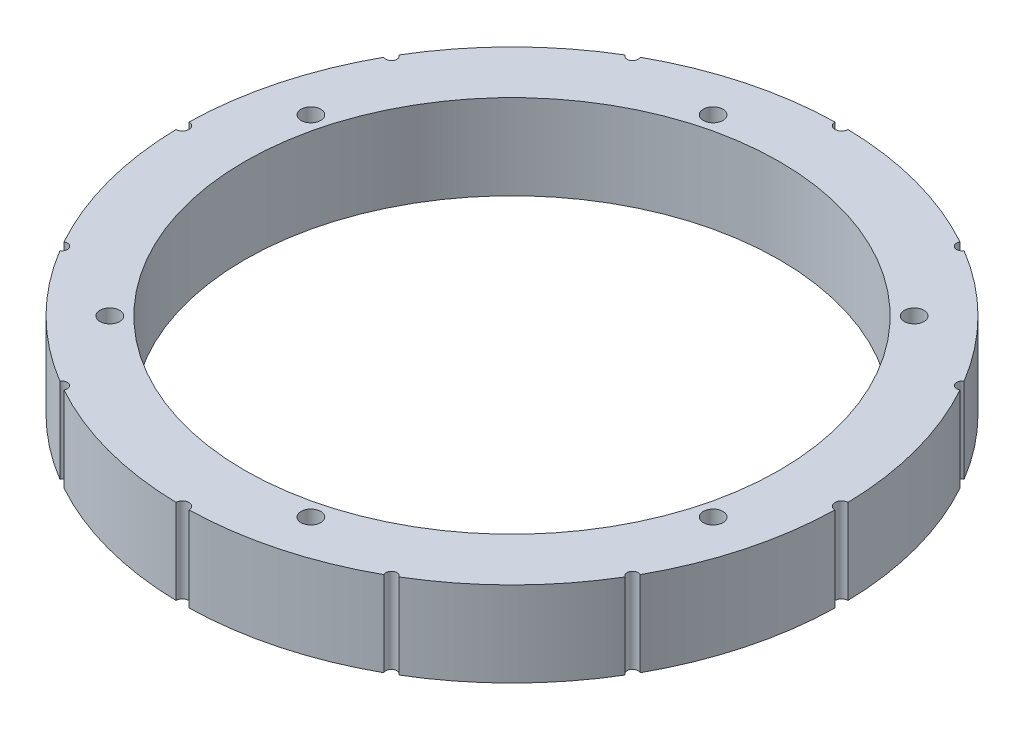
ISO-10303-21;
HEADER;
FILE_DESCRIPTION(('STEP AP214'),'2;1');
FILE_NAME('part.step','',(''),(''),'','','');
FILE_SCHEMA(('AUTOMOTIVE_DESIGN { 1 0 10303 214 1 1 1 1 }'));
ENDSEC;
DATA;
#1=APPLICATION_CONTEXT('core data for automotive mechanical design processes');
#2=APPLICATION_PROTOCOL_DEFINITION('international standard','automotive_design',2000,#1);
#3=PRODUCT_CONTEXT('',#1,'mechanical');
#4=PRODUCT('Part','Part','',(#3));
#5=PRODUCT_RELATED_PRODUCT_CATEGORY('part','',(#4));
#6=PRODUCT_DEFINITION_FORMATION('','',#4);
#7=PRODUCT_DEFINITION_CONTEXT('part definition',#1,'design');
#8=PRODUCT_DEFINITION('design','',#6,#7);
#9=PRODUCT_DEFINITION_SHAPE('','',#8);
#10=(LENGTH_UNIT() NAMED_UNIT(*) SI_UNIT(.MILLI.,.METRE.));
#11=(NAMED_UNIT(*) PLANE_ANGLE_UNIT() SI_UNIT($,.RADIAN.));
#12=(NAMED_UNIT(*) SI_UNIT($,.STERADIAN.) SOLID_ANGLE_UNIT());
#13=UNCERTAINTY_MEASURE_WITH_UNIT(LENGTH_MEASURE(1.E-05),#10,'distance_accuracy_value','');
#14=(GEOMETRIC_REPRESENTATION_CONTEXT(3) GLOBAL_UNCERTAINTY_ASSIGNED_CONTEXT((#13)) GLOBAL_UNIT_ASSIGNED_CONTEXT((#10,
#11,#12)) REPRESENTATION_CONTEXT('',''));
#15=CARTESIAN_POINT('',(0.,0.,0.));
#16=DIRECTION('',(0.,0.,1.));
#17=DIRECTION('',(1.,0.,0.));
#18=AXIS2_PLACEMENT_3D('',#15,#16,#17);
#19=CARTESIAN_POINT('',(0.,-13.,0.));
#20=DIRECTION('',(0.,1.,0.));
#21=DIRECTION('',(0.,0.,1.));
#22=AXIS2_PLACEMENT_3D('',#19,#20,#21);
#23=CYLINDRICAL_SURFACE('',#22,50.4);
#24=DIRECTION('',(0.,-1.,0.));
#25=VECTOR('',#24,1.);
#26=CARTESIAN_POINT('',(0.999950789290539,-6.5,50.3900793650794));
#27=LINE('',#26,#25);
#28=CARTESIAN_POINT('',(0.999950789290539,-13.,50.3900793650794));
#29=VERTEX_POINT('',#28);
#30=CARTESIAN_POINT('',(0.999950789290547,0.,50.3900793650794));
#31=VERTEX_POINT('',#30);
#32=EDGE_CURVE('E286',#29,#31,#27,.F.);
#33=ORIENTED_EDGE('',*,*,#32,.F.);
#34=CARTESIAN_POINT('',(0.,-13.,0.));
#35=DIRECTION('',(0.,1.,0.));
#36=DIRECTION('',(0.,0.,1.));
#37=AXIS2_PLACEMENT_3D('',#34,#35,#36);
#38=CIRCLE('',#37,50.4);
#39=CARTESIAN_POINT('',(24.4603207498496,-13.,44.0664578655294));
#40=VERTEX_POINT('',#39);
#41=EDGE_CURVE('E237',#29,#40,#38,.T.);
#42=ORIENTED_EDGE('',*,*,#41,.T.);
#43=DIRECTION('',(0.,-1.,0.));
#44=VECTOR('',#43,1.);
#45=CARTESIAN_POINT('',(24.4603207498496,-6.5,44.0664578655294));
#46=LINE('',#45,#44);
#47=CARTESIAN_POINT('',(24.4603207498496,0.,44.0664578655294));
#48=VERTEX_POINT('',#47);
#49=EDGE_CURVE('E315',#48,#40,#46,.T.);
#50=ORIENTED_EDGE('',*,*,#49,.F.);
#51=CARTESIAN_POINT('',(0.,0.,0.));
#52=DIRECTION('',(0.,1.,0.));
#53=DIRECTION('',(0.,0.,1.));
#54=AXIS2_PLACEMENT_3D('',#51,#52,#53);
#55=CIRCLE('',#54,50.4);
#56=EDGE_CURVE('E230',#31,#48,#55,.T.);
#57=ORIENTED_EDGE('',*,*,#56,.F.);
#58=EDGE_LOOP('',(#33,#42,#50,#57));
#59=FACE_BOUND('',#58,.T.);
#60=ADVANCED_FACE('F36',(#59),#23,.T.);
#61=DIRECTION('',(0.,-1.,0.));
#62=VECTOR('',#61,1.);
#63=CARTESIAN_POINT('',(-43.2164880868497,-6.5,25.9325115914209));
#64=LINE('',#63,#62);
#65=CARTESIAN_POINT('',(-43.2164880868497,-13.,25.9325115914209));
#66=VERTEX_POINT('',#65);
#67=CARTESIAN_POINT('',(-43.2164880868495,0.,25.9325115914212));
#68=VERTEX_POINT('',#67);
#69=EDGE_CURVE('E59',#66,#68,#64,.F.);
#70=ORIENTED_EDGE('',*,*,#69,.F.);
#71=CARTESIAN_POINT('',(-25.9325115914204,-13.,43.21648808685));
#72=VERTEX_POINT('',#71);
#73=EDGE_CURVE('E476',#66,#72,#38,.T.);
#74=ORIENTED_EDGE('',*,*,#73,.T.);
#75=DIRECTION('',(0.,-1.,0.));
#76=VECTOR('',#75,1.);
#77=CARTESIAN_POINT('',(-25.9325115914204,-6.5,43.21648808685));
#78=LINE('',#77,#76);
#79=CARTESIAN_POINT('',(-25.9325115914204,0.,43.21648808685));
#80=VERTEX_POINT('',#79);
#81=EDGE_CURVE('E311',#80,#72,#78,.T.);
#82=ORIENTED_EDGE('',*,*,#81,.F.);
#83=EDGE_CURVE('E273',#68,#80,#55,.T.);
#84=ORIENTED_EDGE('',*,*,#83,.F.);
#85=EDGE_LOOP('',(#70,#74,#82,#84));
#86=FACE_BOUND('',#85,.T.);
#87=ADVANCED_FACE('F438',(#86),#23,.T.);
#88=DIRECTION('',(0.,-1.,0.));
#89=VECTOR('',#88,1.);
#90=CARTESIAN_POINT('',(-44.0664578655266,-6.5,-24.4603207498546));
#91=LINE('',#90,#89);
#92=CARTESIAN_POINT('',(-44.0664578655266,-13.,-24.4603207498546));
#93=VERTEX_POINT('',#92);
#94=CARTESIAN_POINT('',(-44.0664578655265,0.,-24.4603207498548));
#95=VERTEX_POINT('',#94);
#96=EDGE_CURVE('E294',#93,#95,#91,.F.);
#97=ORIENTED_EDGE('',*,*,#96,.F.);
#98=CARTESIAN_POINT('',(-50.3900793650794,-13.,-0.999950789290546));
#99=VERTEX_POINT('',#98);
#100=EDGE_CURVE('E466',#93,#99,#38,.T.);
#101=ORIENTED_EDGE('',*,*,#100,.T.);
#102=DIRECTION('',(0.,-1.,0.));
#103=VECTOR('',#102,1.);
#104=CARTESIAN_POINT('',(-50.3900793650794,-6.5,-0.999950789290546));
#105=LINE('',#104,#103);
#106=CARTESIAN_POINT('',(-50.3900793650794,0.,-0.999950789290546));
#107=VERTEX_POINT('',#106);
#108=EDGE_CURVE('E308',#107,#99,#105,.T.);
#109=ORIENTED_EDGE('',*,*,#108,.F.);
#110=EDGE_CURVE('E266',#95,#107,#55,.T.);
#111=ORIENTED_EDGE('',*,*,#110,.F.);
#112=EDGE_LOOP('',(#97,#101,#109,#111));
#113=FACE_BOUND('',#112,.T.);
#114=ADVANCED_FACE('F443',(#113),#23,.T.);
#115=DIRECTION('',(0.,-1.,0.));
#116=VECTOR('',#115,1.);
#117=CARTESIAN_POINT('',(-43.216488086847,-6.5,-25.9325115914254));
#118=LINE('',#117,#116);
#119=CARTESIAN_POINT('',(-43.216488086847,0.,-25.9325115914254));
#120=VERTEX_POINT('',#119);
#121=CARTESIAN_POINT('',(-43.216488086847,-13.,-25.9325115914254));
#122=VERTEX_POINT('',#121);
#123=EDGE_CURVE('E296',#120,#122,#118,.T.);
#124=ORIENTED_EDGE('',*,*,#123,.F.);
#125=CARTESIAN_POINT('',(-25.9325115914152,0.,-43.2164880868531));
#126=VERTEX_POINT('',#125);
#127=EDGE_CURVE('E265',#126,#120,#55,.T.);
#128=ORIENTED_EDGE('',*,*,#127,.F.);
#129=DIRECTION('',(0.,-1.,0.));
#130=VECTOR('',#129,1.);
#131=CARTESIAN_POINT('',(-25.9325115914149,-6.5,-43.2164880868533));
#132=LINE('',#131,#130);
#133=CARTESIAN_POINT('',(-25.9325115914149,-13.,-43.2164880868533));
#134=VERTEX_POINT('',#133);
#135=EDGE_CURVE('E250',#134,#126,#132,.F.);
#136=ORIENTED_EDGE('',*,*,#135,.F.);
#137=EDGE_CURVE('E464',#134,#122,#38,.T.);
#138=ORIENTED_EDGE('',*,*,#137,.T.);
#139=EDGE_LOOP('',(#124,#128,#136,#138));
#140=FACE_BOUND('',#139,.T.);
#141=ADVANCED_FACE('F809',(#140),#23,.T.);
#142=DIRECTION('',(0.,-1.,0.));
#143=VECTOR('',#142,1.);
#144=CARTESIAN_POINT('',(50.3900793650794,-6.5,-0.999950789290533));
#145=LINE('',#144,#143);
#146=CARTESIAN_POINT('',(50.3900793650794,-13.,-0.999950789290533));
#147=VERTEX_POINT('',#146);
#148=CARTESIAN_POINT('',(50.3900793650794,0.,-0.999950789290544));
#149=VERTEX_POINT('',#148);
#150=EDGE_CURVE('E261',#147,#149,#145,.F.);
#151=ORIENTED_EDGE('',*,*,#150,.F.);
#152=CARTESIAN_POINT('',(44.0664578655328,-13.,-24.4603207498434));
#153=VERTEX_POINT('',#152);
#154=EDGE_CURVE('E498',#147,#153,#38,.T.);
#155=ORIENTED_EDGE('',*,*,#154,.T.);
#156=DIRECTION('',(0.,-1.,0.));
#157=VECTOR('',#156,1.);
#158=CARTESIAN_POINT('',(44.0664578655328,-6.5,-24.4603207498434));
#159=LINE('',#158,#157);
#160=CARTESIAN_POINT('',(44.0664578655328,0.,-24.4603207498434));
#161=VERTEX_POINT('',#160);
#162=EDGE_CURVE('E323',#161,#153,#159,.T.);
#163=ORIENTED_EDGE('',*,*,#162,.F.);
#164=EDGE_CURVE('E225',#149,#161,#55,.T.);
#165=ORIENTED_EDGE('',*,*,#164,.F.);
#166=EDGE_LOOP('',(#151,#155,#163,#165));
#167=FACE_BOUND('',#166,.T.);
#168=ADVANCED_FACE('F508',(#167),#23,.T.);
#169=DIRECTION('',(0.,-1.,0.));
#170=VECTOR('',#169,1.);
#171=CARTESIAN_POINT('',(-24.4603207498439,-6.5,-44.0664578655326));
#172=LINE('',#171,#170);
#173=CARTESIAN_POINT('',(-24.4603207498439,0.,-44.0664578655326));
#174=VERTEX_POINT('',#173);
#175=CARTESIAN_POINT('',(-24.4603207498439,-13.,-44.0664578655326));
#176=VERTEX_POINT('',#175);
#177=EDGE_CURVE('E247',#174,#176,#172,.T.);
#178=ORIENTED_EDGE('',*,*,#177,.F.);
#179=CARTESIAN_POINT('',(-0.999950789290541,0.,-50.3900793650794));
#180=VERTEX_POINT('',#179);
#181=EDGE_CURVE('E229',#180,#174,#55,.T.);
#182=ORIENTED_EDGE('',*,*,#181,.F.);
#183=DIRECTION('',(0.,-1.,0.));
#184=VECTOR('',#183,1.);
#185=CARTESIAN_POINT('',(-0.999950789290533,-6.5,-50.3900793650794));
#186=LINE('',#185,#184);
#187=CARTESIAN_POINT('',(-0.999950789290533,-13.,-50.3900793650794));
#188=VERTEX_POINT('',#187);
#189=EDGE_CURVE('E302',#188,#180,#186,.F.);
#190=ORIENTED_EDGE('',*,*,#189,.F.);
#191=EDGE_CURVE('E260',#188,#176,#38,.T.);
#192=ORIENTED_EDGE('',*,*,#191,.T.);
#193=EDGE_LOOP('',(#178,#182,#190,#192));
#194=FACE_BOUND('',#193,.T.);
#195=ADVANCED_FACE('F257',(#194),#23,.T.);
#196=DIRECTION('',(0.,-1.,0.));
#197=VECTOR('',#196,1.);
#198=CARTESIAN_POINT('',(-44.0664578655292,-6.5,24.46032074985));
#199=LINE('',#198,#197);
#200=CARTESIAN_POINT('',(-44.0664578655292,0.,24.46032074985));
#201=VERTEX_POINT('',#200);
#202=CARTESIAN_POINT('',(-44.0664578655292,-13.,24.46032074985));
#203=VERTEX_POINT('',#202);
#204=EDGE_CURVE('E292',#201,#203,#199,.T.);
#205=ORIENTED_EDGE('',*,*,#204,.F.);
#206=CARTESIAN_POINT('',(-50.3900793650794,0.,0.999950789290539));
#207=VERTEX_POINT('',#206);
#208=EDGE_CURVE('E269',#207,#201,#55,.T.);
#209=ORIENTED_EDGE('',*,*,#208,.F.);
#210=DIRECTION('',(0.,-1.,0.));
#211=VECTOR('',#210,1.);
#212=CARTESIAN_POINT('',(-50.3900793650794,-6.5,0.999950789290528));
#213=LINE('',#212,#211);
#214=CARTESIAN_POINT('',(-50.3900793650794,-13.,0.999950789290528));
#215=VERTEX_POINT('',#214);
#216=EDGE_CURVE('E306',#215,#207,#213,.F.);
#217=ORIENTED_EDGE('',*,*,#216,.F.);
#218=EDGE_CURVE('E470',#215,#203,#38,.T.);
#219=ORIENTED_EDGE('',*,*,#218,.T.);
#220=EDGE_LOOP('',(#205,#209,#217,#219));
#221=FACE_BOUND('',#220,.T.);
#222=ADVANCED_FACE('F790',(#221),#23,.T.);
#223=DIRECTION('',(0.,-1.,0.));
#224=VECTOR('',#223,1.);
#225=CARTESIAN_POINT('',(-0.999950789290539,-6.5,50.3900793650794));
#226=LINE('',#225,#224);
#227=CARTESIAN_POINT('',(-0.999950789290539,0.,50.3900793650794));
#228=VERTEX_POINT('',#227);
#229=CARTESIAN_POINT('',(-0.999950789290539,-13.,50.3900793650794));
#230=VERTEX_POINT('',#229);
#231=EDGE_CURVE('E289',#228,#230,#226,.T.);
#232=ORIENTED_EDGE('',*,*,#231,.F.);
#233=CARTESIAN_POINT('',(-24.4603207498497,0.,44.0664578655293));
#234=VERTEX_POINT('',#233);
#235=EDGE_CURVE('E236',#234,#228,#55,.T.);
#236=ORIENTED_EDGE('',*,*,#235,.F.);
#237=DIRECTION('',(0.,-1.,0.));
#238=VECTOR('',#237,1.);
#239=CARTESIAN_POINT('',(-24.4603207498496,-6.5,44.0664578655294));
#240=LINE('',#239,#238);
#241=CARTESIAN_POINT('',(-24.4603207498496,-13.,44.0664578655294));
#242=VERTEX_POINT('',#241);
#243=EDGE_CURVE('E51',#242,#234,#240,.F.);
#244=ORIENTED_EDGE('',*,*,#243,.F.);
#245=EDGE_CURVE('E234',#242,#230,#38,.T.);
#246=ORIENTED_EDGE('',*,*,#245,.T.);
#247=EDGE_LOOP('',(#232,#236,#244,#246));
#248=FACE_BOUND('',#247,.T.);
#249=ADVANCED_FACE('F783',(#248),#23,.T.);
#250=DIRECTION('',(0.,-1.,0.));
#251=VECTOR('',#250,1.);
#252=CARTESIAN_POINT('',(25.9325115914204,-6.5,43.21648808685));
#253=LINE('',#252,#251);
#254=CARTESIAN_POINT('',(25.9325115914204,-13.,43.21648808685));
#255=VERTEX_POINT('',#254);
#256=CARTESIAN_POINT('',(25.9325115914203,0.,43.2164880868501));
#257=VERTEX_POINT('',#256);
#258=EDGE_CURVE('E313',#255,#257,#253,.F.);
#259=ORIENTED_EDGE('',*,*,#258,.F.);
#260=CARTESIAN_POINT('',(43.216488086848,-13.,25.9325115914238));
#261=VERTEX_POINT('',#260);
#262=EDGE_CURVE('E489',#255,#261,#38,.T.);
#263=ORIENTED_EDGE('',*,*,#262,.T.);
#264=DIRECTION('',(0.,-1.,0.));
#265=VECTOR('',#264,1.);
#266=CARTESIAN_POINT('',(43.216488086848,-6.5,25.9325115914238));
#267=LINE('',#266,#265);
#268=CARTESIAN_POINT('',(43.216488086848,0.,25.9325115914238));
#269=VERTEX_POINT('',#268);
#270=EDGE_CURVE('E319',#269,#261,#267,.T.);
#271=ORIENTED_EDGE('',*,*,#270,.F.);
#272=EDGE_CURVE('E235',#257,#269,#55,.T.);
#273=ORIENTED_EDGE('',*,*,#272,.F.);
#274=EDGE_LOOP('',(#259,#263,#271,#273));
#275=FACE_BOUND('',#274,.T.);
#276=ADVANCED_FACE('F776',(#275),#23,.T.);
#277=DIRECTION('',(0.,-1.,0.));
#278=VECTOR('',#277,1.);
#279=CARTESIAN_POINT('',(50.3900793650794,-6.5,0.99995078929054));
#280=LINE('',#279,#278);
#281=CARTESIAN_POINT('',(50.3900793650794,0.,0.99995078929054));
#282=VERTEX_POINT('',#281);
#283=CARTESIAN_POINT('',(50.3900793650794,-13.,0.99995078929054));
#284=VERTEX_POINT('',#283);
#285=EDGE_CURVE('E300',#282,#284,#280,.T.);
#286=ORIENTED_EDGE('',*,*,#285,.F.);
#287=CARTESIAN_POINT('',(44.0664578655274,0.,24.4603207498532));
#288=VERTEX_POINT('',#287);
#289=EDGE_CURVE('E228',#288,#282,#55,.T.);
#290=ORIENTED_EDGE('',*,*,#289,.F.);
#291=DIRECTION('',(0.,-1.,0.));
#292=VECTOR('',#291,1.);
#293=CARTESIAN_POINT('',(44.0664578655274,-6.5,24.4603207498531));
#294=LINE('',#293,#292);
#295=CARTESIAN_POINT('',(44.0664578655274,-13.,24.4603207498531));
#296=VERTEX_POINT('',#295);
#297=EDGE_CURVE('E317',#296,#288,#294,.F.);
#298=ORIENTED_EDGE('',*,*,#297,.F.);
#299=EDGE_CURVE('E492',#296,#284,#38,.T.);
#300=ORIENTED_EDGE('',*,*,#299,.T.);
#301=EDGE_LOOP('',(#286,#290,#298,#300));
#302=FACE_BOUND('',#301,.T.);
#303=ADVANCED_FACE('F453',(#302),#23,.T.);
#304=DIRECTION('',(0.,-1.,0.));
#305=VECTOR('',#304,1.);
#306=CARTESIAN_POINT('',(43.2164880868536,-6.5,-25.9325115914144));
#307=LINE('',#306,#305);
#308=CARTESIAN_POINT('',(43.2164880868536,-13.,-25.9325115914144));
#309=VERTEX_POINT('',#308);
#310=CARTESIAN_POINT('',(43.2164880868537,0.,-25.9325115914143));
#311=VERTEX_POINT('',#310);
#312=EDGE_CURVE('E321',#309,#311,#307,.F.);
#313=ORIENTED_EDGE('',*,*,#312,.F.);
#314=CARTESIAN_POINT('',(25.9325115914288,-13.,-43.216488086845));
#315=VERTEX_POINT('',#314);
#316=EDGE_CURVE('E216',#309,#315,#38,.T.);
#317=ORIENTED_EDGE('',*,*,#316,.T.);
#318=DIRECTION('',(0.,-1.,0.));
#319=VECTOR('',#318,1.);
#320=CARTESIAN_POINT('',(25.9325115914288,-6.5,-43.216488086845));
#321=LINE('',#320,#319);
#322=CARTESIAN_POINT('',(25.9325115914288,0.,-43.216488086845));
#323=VERTEX_POINT('',#322);
#324=EDGE_CURVE('E198',#323,#315,#321,.T.);
#325=ORIENTED_EDGE('',*,*,#324,.F.);
#326=EDGE_CURVE('E214',#311,#323,#55,.T.);
#327=ORIENTED_EDGE('',*,*,#326,.F.);
#328=EDGE_LOOP('',(#313,#317,#325,#327));
#329=FACE_BOUND('',#328,.T.);
#330=ADVANCED_FACE('F213',(#329),#23,.T.);
#331=DIRECTION('',(0.,-1.,0.));
#332=VECTOR('',#331,1.);
#333=CARTESIAN_POINT('',(0.999950789290546,-6.5,-50.3900793650794));
#334=LINE('',#333,#332);
#335=CARTESIAN_POINT('',(0.999950789290546,0.,-50.3900793650794));
#336=VERTEX_POINT('',#335);
#337=CARTESIAN_POINT('',(0.999950789290546,-13.,-50.3900793650794));
#338=VERTEX_POINT('',#337);
#339=EDGE_CURVE('E304',#336,#338,#334,.T.);
#340=ORIENTED_EDGE('',*,*,#339,.F.);
#341=CARTESIAN_POINT('',(24.4603207498583,0.,-44.0664578655246));
#342=VERTEX_POINT('',#341);
#343=EDGE_CURVE('E226',#342,#336,#55,.T.);
#344=ORIENTED_EDGE('',*,*,#343,.F.);
#345=DIRECTION('',(0.,-1.,0.));
#346=VECTOR('',#345,1.);
#347=CARTESIAN_POINT('',(24.4603207498582,-6.5,-44.0664578655246));
#348=LINE('',#347,#346);
#349=CARTESIAN_POINT('',(24.4603207498582,-13.,-44.0664578655246));
#350=VERTEX_POINT('',#349);
#351=EDGE_CURVE('E201',#350,#342,#348,.F.);
#352=ORIENTED_EDGE('',*,*,#351,.F.);
#353=EDGE_CURVE('E457',#350,#338,#38,.T.);
#354=ORIENTED_EDGE('',*,*,#353,.T.);
#355=EDGE_LOOP('',(#340,#344,#352,#354));
#356=FACE_BOUND('',#355,.T.);
#357=ADVANCED_FACE('F38',(#356),#23,.T.);
#358=CARTESIAN_POINT('',(0.,-13.,0.));
#359=DIRECTION('',(0.,1.,0.));
#360=DIRECTION('',(0.,0.,1.));
#361=AXIS2_PLACEMENT_3D('',#358,#359,#360);
#362=PLANE('',#361);
#363=CARTESIAN_POINT('',(0.,-13.,0.));
#364=DIRECTION('',(0.,1.,0.));
#365=DIRECTION('',(0.,0.,1.));
#366=AXIS2_PLACEMENT_3D('',#363,#364,#365);
#367=CIRCLE('',#366,40.9);
#368=CARTESIAN_POINT('',(0.,-13.,40.9));
#369=VERTEX_POINT('',#368);
#370=EDGE_CURVE('E278',#369,#369,#367,.T.);
#371=ORIENTED_EDGE('',*,*,#370,.T.);
#372=EDGE_LOOP('',(#371));
#373=FACE_BOUND('',#372,.T.);
#374=ORIENTED_EDGE('',*,*,#41,.F.);
#375=CARTESIAN_POINT('',(0.,-13.,50.4));
#376=DIRECTION('',(0.,-1.,0.));
#377=DIRECTION('',(0.,0.,-1.));
#378=AXIS2_PLACEMENT_3D('',#375,#376,#377);
#379=CIRCLE('',#378,1.);
#380=EDGE_CURVE('E217',#230,#29,#379,.T.);
#381=ORIENTED_EDGE('',*,*,#380,.F.);
#382=ORIENTED_EDGE('',*,*,#245,.F.);
#383=CARTESIAN_POINT('',(-25.2000000000001,-13.,43.6476803507357));
#384=DIRECTION('',(0.,-1.,0.));
#385=DIRECTION('',(0.,0.,-1.));
#386=AXIS2_PLACEMENT_3D('',#383,#384,#385);
#387=CIRCLE('',#386,0.850000000000001);
#388=EDGE_CURVE('E326',#72,#242,#387,.T.);
#389=ORIENTED_EDGE('',*,*,#388,.F.);
#390=ORIENTED_EDGE('',*,*,#73,.F.);
#391=CARTESIAN_POINT('',(-43.6476803507293,-13.,25.199999999997));
#392=DIRECTION('',(0.,-1.,0.));
#393=DIRECTION('',(0.,0.,1.));
#394=AXIS2_PLACEMENT_3D('',#391,#392,#393);
#395=CIRCLE('',#394,0.85);
#396=EDGE_CURVE('E350',#203,#66,#395,.T.);
#397=ORIENTED_EDGE('',*,*,#396,.F.);
#398=ORIENTED_EDGE('',*,*,#218,.F.);
#399=CARTESIAN_POINT('',(-50.4,-13.,0.));
#400=DIRECTION('',(0.,-1.,0.));
#401=DIRECTION('',(0.,0.,-1.));
#402=AXIS2_PLACEMENT_3D('',#399,#400,#401);
#403=CIRCLE('',#402,0.999999999999998);
#404=EDGE_CURVE('E328',#99,#215,#403,.T.);
#405=ORIENTED_EDGE('',*,*,#404,.F.);
#406=ORIENTED_EDGE('',*,*,#100,.F.);
#407=CARTESIAN_POINT('',(-43.6476803507293,-13.,-25.2000000000031));
#408=DIRECTION('',(0.,-1.,0.));
#409=DIRECTION('',(0.,0.,-1.));
#410=AXIS2_PLACEMENT_3D('',#407,#408,#409);
#411=CIRCLE('',#410,0.850000000000006);
#412=EDGE_CURVE('E355',#122,#93,#411,.T.);
#413=ORIENTED_EDGE('',*,*,#412,.F.);
#414=ORIENTED_EDGE('',*,*,#137,.F.);
#415=CARTESIAN_POINT('',(-25.1999999999907,-13.,-43.6476803507323));
#416=DIRECTION('',(0.,-1.,0.));
#417=DIRECTION('',(0.,0.,1.));
#418=AXIS2_PLACEMENT_3D('',#415,#416,#417);
#419=CIRCLE('',#418,0.849999999999995);
#420=EDGE_CURVE('E341',#176,#134,#419,.T.);
#421=ORIENTED_EDGE('',*,*,#420,.F.);
#422=ORIENTED_EDGE('',*,*,#191,.F.);
#423=CARTESIAN_POINT('',(0.,-13.,-50.4));
#424=DIRECTION('',(0.,-1.,0.));
#425=DIRECTION('',(0.,0.,-1.));
#426=AXIS2_PLACEMENT_3D('',#423,#424,#425);
#427=CIRCLE('',#426,1.);
#428=EDGE_CURVE('E333',#338,#188,#427,.T.);
#429=ORIENTED_EDGE('',*,*,#428,.F.);
#430=ORIENTED_EDGE('',*,*,#353,.F.);
#431=CARTESIAN_POINT('',(25.2000000000095,-13.,-43.6476803507323));
#432=DIRECTION('',(0.,-1.,0.));
#433=DIRECTION('',(0.,0.,-1.));
#434=AXIS2_PLACEMENT_3D('',#431,#432,#433);
#435=CIRCLE('',#434,0.850000000000004);
#436=EDGE_CURVE('E207',#315,#350,#435,.T.);
#437=ORIENTED_EDGE('',*,*,#436,.F.);
#438=ORIENTED_EDGE('',*,*,#316,.F.);
#439=CARTESIAN_POINT('',(43.6476803507387,-13.,-25.1999999999937));
#440=DIRECTION('',(0.,-1.,0.));
#441=DIRECTION('',(0.,0.,1.));
#442=AXIS2_PLACEMENT_3D('',#439,#440,#441);
#443=CIRCLE('',#442,0.850000000000006);
#444=EDGE_CURVE('E206',#153,#309,#443,.T.);
#445=ORIENTED_EDGE('',*,*,#444,.F.);
#446=ORIENTED_EDGE('',*,*,#154,.F.);
#447=CARTESIAN_POINT('',(50.4,-13.,0.));
#448=DIRECTION('',(0.,-1.,0.));
#449=DIRECTION('',(0.,0.,-1.));
#450=AXIS2_PLACEMENT_3D('',#447,#448,#449);
#451=CIRCLE('',#450,0.999999999999998);
#452=EDGE_CURVE('E336',#284,#147,#451,.T.);
#453=ORIENTED_EDGE('',*,*,#452,.F.);
#454=ORIENTED_EDGE('',*,*,#299,.F.);
#455=CARTESIAN_POINT('',(43.6476803507387,-13.,25.2000000000064));
#456=DIRECTION('',(0.,-1.,0.));
#457=DIRECTION('',(0.,0.,-1.));
#458=AXIS2_PLACEMENT_3D('',#455,#456,#457);
#459=CIRCLE('',#458,0.850000000000006);
#460=EDGE_CURVE('E344',#261,#296,#459,.T.);
#461=ORIENTED_EDGE('',*,*,#460,.F.);
#462=ORIENTED_EDGE('',*,*,#262,.F.);
#463=CARTESIAN_POINT('',(25.2000000000001,-13.,43.6476803507357));
#464=DIRECTION('',(0.,-1.,0.));
#465=DIRECTION('',(0.,0.,1.));
#466=AXIS2_PLACEMENT_3D('',#463,#464,#465);
#467=CIRCLE('',#466,0.850000000000001);
#468=EDGE_CURVE('E346',#40,#255,#467,.T.);
#469=ORIENTED_EDGE('',*,*,#468,.F.);
#470=EDGE_LOOP('',(#374,#381,#382,#389,#390,#397,#398,#405,#406,#413,#414,#421,#422,#429,#430,
#437,#438,#445,#446,#453,#454,#461,#462,#469));
#471=FACE_BOUND('',#470,.T.);
#472=ADVANCED_FACE('F409',(#373,#471),#362,.F.);
#473=CARTESIAN_POINT('',(0.,0.,0.));
#474=DIRECTION('',(0.,1.,0.));
#475=DIRECTION('',(0.,0.,1.));
#476=AXIS2_PLACEMENT_3D('',#473,#474,#475);
#477=PLANE('',#476);
#478=CARTESIAN_POINT('',(30.7591449816151,0.,-30.7591449816145));
#479=DIRECTION('',(0.,1.,0.));
#480=DIRECTION('',(-0.86602540378444,0.,0.499999999999998));
#481=AXIS2_PLACEMENT_3D('',#478,#479,#480);
#482=CIRCLE('',#481,1.5);
#483=CARTESIAN_POINT('',(29.4601068759384,0.,-30.0091449816145));
#484=VERTEX_POINT('',#483);
#485=EDGE_CURVE('E391',#484,#484,#482,.T.);
#486=ORIENTED_EDGE('',*,*,#485,.F.);
#487=EDGE_LOOP('',(#486));
#488=FACE_BOUND('',#487,.T.);
#489=CARTESIAN_POINT('',(42.0177734435743,0.,11.2586284619601));
#490=DIRECTION('',(0.,1.,0.));
#491=DIRECTION('',(-0.866025403784436,0.,-0.500000000000004));
#492=AXIS2_PLACEMENT_3D('',#489,#490,#491);
#493=CIRCLE('',#492,1.5);
#494=CARTESIAN_POINT('',(40.7187353378977,0.,10.5086284619601));
#495=VERTEX_POINT('',#494);
#496=EDGE_CURVE('E385',#495,#495,#493,.T.);
#497=ORIENTED_EDGE('',*,*,#496,.F.);
#498=EDGE_LOOP('',(#497));
#499=FACE_BOUND('',#498,.T.);
#500=CARTESIAN_POINT('',(11.2586284619594,0.,42.0177734435745));
#501=DIRECTION('',(0.,1.,0.));
#502=DIRECTION('',(0.,0.,-1.));
#503=AXIS2_PLACEMENT_3D('',#500,#501,#502);
#504=CIRCLE('',#503,1.5);
#505=CARTESIAN_POINT('',(11.2586284619594,0.,40.5177734435745));
#506=VERTEX_POINT('',#505);
#507=EDGE_CURVE('E379',#506,#506,#504,.T.);
#508=ORIENTED_EDGE('',*,*,#507,.F.);
#509=EDGE_LOOP('',(#508));
#510=FACE_BOUND('',#509,.T.);
#511=CARTESIAN_POINT('',(-30.7591449816153,0.,30.7591449816143));
#512=DIRECTION('',(0.,1.,0.));
#513=DIRECTION('',(0.866025403784443,0.,-0.499999999999992));
#514=AXIS2_PLACEMENT_3D('',#511,#512,#513);
#515=CIRCLE('',#514,1.5);
#516=CARTESIAN_POINT('',(-29.4601068759386,0.,30.0091449816143));
#517=VERTEX_POINT('',#516);
#518=EDGE_CURVE('E373',#517,#517,#515,.T.);
#519=ORIENTED_EDGE('',*,*,#518,.F.);
#520=EDGE_LOOP('',(#519));
#521=FACE_BOUND('',#520,.T.);
#522=CARTESIAN_POINT('',(-42.0177734435743,0.,-11.2586284619604));
#523=DIRECTION('',(0.,1.,0.));
#524=DIRECTION('',(0.866025403784433,0.,0.50000000000001));
#525=AXIS2_PLACEMENT_3D('',#522,#523,#524);
#526=CIRCLE('',#525,1.5);
#527=CARTESIAN_POINT('',(-40.7187353378976,0.,-10.5086284619604));
#528=VERTEX_POINT('',#527);
#529=EDGE_CURVE('E367',#528,#528,#526,.T.);
#530=ORIENTED_EDGE('',*,*,#529,.F.);
#531=EDGE_LOOP('',(#530));
#532=FACE_BOUND('',#531,.T.);
#533=CARTESIAN_POINT('',(-11.2586284619594,0.,-42.0177734435745));
#534=DIRECTION('',(0.,1.,0.));
#535=DIRECTION('',(0.,0.,1.));
#536=AXIS2_PLACEMENT_3D('',#533,#534,#535);
#537=CIRCLE('',#536,1.5);
#538=CARTESIAN_POINT('',(-11.2586284619594,0.,-40.5177734435745));
#539=VERTEX_POINT('',#538);
#540=EDGE_CURVE('E361',#539,#539,#537,.T.);
#541=ORIENTED_EDGE('',*,*,#540,.F.);
#542=EDGE_LOOP('',(#541));
#543=FACE_BOUND('',#542,.T.);
#544=CARTESIAN_POINT('',(0.,0.,50.4));
#545=DIRECTION('',(0.,1.,0.));
#546=DIRECTION('',(0.,0.,1.));
#547=AXIS2_PLACEMENT_3D('',#544,#545,#546);
#548=CIRCLE('',#547,1.);
#549=EDGE_CURVE('E11',#31,#228,#548,.T.);
#550=ORIENTED_EDGE('',*,*,#549,.F.);
#551=ORIENTED_EDGE('',*,*,#56,.T.);
#552=CARTESIAN_POINT('',(25.2000000000001,0.,43.6476803507357));
#553=DIRECTION('',(0.,-1.,0.));
#554=DIRECTION('',(0.,0.,1.));
#555=AXIS2_PLACEMENT_3D('',#552,#553,#554);
#556=CIRCLE('',#555,0.850000000000001);
#557=EDGE_CURVE('E329',#48,#257,#556,.T.);
#558=ORIENTED_EDGE('',*,*,#557,.T.);
#559=ORIENTED_EDGE('',*,*,#272,.T.);
#560=CARTESIAN_POINT('',(43.6476803507387,0.,25.2000000000064));
#561=DIRECTION('',(0.,1.,0.));
#562=DIRECTION('',(0.,0.,1.));
#563=AXIS2_PLACEMENT_3D('',#560,#561,#562);
#564=CIRCLE('',#563,0.850000000000006);
#565=EDGE_CURVE('E240',#288,#269,#564,.T.);
#566=ORIENTED_EDGE('',*,*,#565,.F.);
#567=ORIENTED_EDGE('',*,*,#289,.T.);
#568=CARTESIAN_POINT('',(50.4,0.,0.));
#569=DIRECTION('',(0.,-1.,0.));
#570=DIRECTION('',(0.,0.,-1.));
#571=AXIS2_PLACEMENT_3D('',#568,#569,#570);
#572=CIRCLE('',#571,0.999999999999998);
#573=EDGE_CURVE('E338',#282,#149,#572,.T.);
#574=ORIENTED_EDGE('',*,*,#573,.T.);
#575=ORIENTED_EDGE('',*,*,#164,.T.);
#576=CARTESIAN_POINT('',(43.6476803507387,0.,-25.1999999999937));
#577=DIRECTION('',(0.,1.,0.));
#578=DIRECTION('',(0.,0.,1.));
#579=AXIS2_PLACEMENT_3D('',#576,#577,#578);
#580=CIRCLE('',#579,0.850000000000006);
#581=EDGE_CURVE('E224',#311,#161,#580,.T.);
#582=ORIENTED_EDGE('',*,*,#581,.F.);
#583=ORIENTED_EDGE('',*,*,#326,.T.);
#584=CARTESIAN_POINT('',(25.2000000000095,0.,-43.6476803507323));
#585=DIRECTION('',(0.,-1.,0.));
#586=DIRECTION('',(0.,0.,-1.));
#587=AXIS2_PLACEMENT_3D('',#584,#585,#586);
#588=CIRCLE('',#587,0.850000000000004);
#589=EDGE_CURVE('E195',#323,#342,#588,.T.);
#590=ORIENTED_EDGE('',*,*,#589,.T.);
#591=ORIENTED_EDGE('',*,*,#343,.T.);
#592=CARTESIAN_POINT('',(0.,0.,-50.4));
#593=DIRECTION('',(0.,-1.,0.));
#594=DIRECTION('',(0.,0.,-1.));
#595=AXIS2_PLACEMENT_3D('',#592,#593,#594);
#596=CIRCLE('',#595,1.);
#597=EDGE_CURVE('E264',#336,#180,#596,.T.);
#598=ORIENTED_EDGE('',*,*,#597,.T.);
#599=ORIENTED_EDGE('',*,*,#181,.T.);
#600=CARTESIAN_POINT('',(-25.1999999999907,0.,-43.6476803507323));
#601=DIRECTION('',(0.,1.,0.));
#602=DIRECTION('',(0.,0.,1.));
#603=AXIS2_PLACEMENT_3D('',#600,#601,#602);
#604=CIRCLE('',#603,0.849999999999995);
#605=EDGE_CURVE('E44',#126,#174,#604,.T.);
#606=ORIENTED_EDGE('',*,*,#605,.F.);
#607=ORIENTED_EDGE('',*,*,#127,.T.);
#608=CARTESIAN_POINT('',(-43.6476803507293,0.,-25.2000000000031));
#609=DIRECTION('',(0.,-1.,0.));
#610=DIRECTION('',(0.,0.,-1.));
#611=AXIS2_PLACEMENT_3D('',#608,#609,#610);
#612=CIRCLE('',#611,0.850000000000006);
#613=EDGE_CURVE('E357',#120,#95,#612,.T.);
#614=ORIENTED_EDGE('',*,*,#613,.T.);
#615=ORIENTED_EDGE('',*,*,#110,.T.);
#616=CARTESIAN_POINT('',(-50.4,0.,0.));
#617=DIRECTION('',(0.,-1.,0.));
#618=DIRECTION('',(0.,0.,-1.));
#619=AXIS2_PLACEMENT_3D('',#616,#617,#618);
#620=CIRCLE('',#619,0.999999999999998);
#621=EDGE_CURVE('E331',#107,#207,#620,.T.);
#622=ORIENTED_EDGE('',*,*,#621,.T.);
#623=ORIENTED_EDGE('',*,*,#208,.T.);
#624=CARTESIAN_POINT('',(-43.6476803507293,0.,25.199999999997));
#625=DIRECTION('',(0.,-1.,0.));
#626=DIRECTION('',(0.,0.,1.));
#627=AXIS2_PLACEMENT_3D('',#624,#625,#626);
#628=CIRCLE('',#627,0.85);
#629=EDGE_CURVE('E352',#201,#68,#628,.T.);
#630=ORIENTED_EDGE('',*,*,#629,.T.);
#631=ORIENTED_EDGE('',*,*,#83,.T.);
#632=CARTESIAN_POINT('',(-25.2000000000001,0.,43.6476803507357));
#633=DIRECTION('',(0.,1.,0.));
#634=DIRECTION('',(0.,0.,1.));
#635=AXIS2_PLACEMENT_3D('',#632,#633,#634);
#636=CIRCLE('',#635,0.850000000000001);
#637=EDGE_CURVE('E242',#234,#80,#636,.T.);
#638=ORIENTED_EDGE('',*,*,#637,.F.);
#639=ORIENTED_EDGE('',*,*,#235,.T.);
#640=EDGE_LOOP('',(#550,#551,#558,#559,#566,#567,#574,#575,#582,#583,#590,#591,#598,#599,#606,
#607,#614,#615,#622,#623,#630,#631,#638,#639));
#641=FACE_BOUND('',#640,.T.);
#642=CARTESIAN_POINT('',(0.,0.,0.));
#643=DIRECTION('',(0.,1.,0.));
#644=DIRECTION('',(0.,0.,1.));
#645=AXIS2_PLACEMENT_3D('',#642,#643,#644);
#646=CIRCLE('',#645,40.9);
#647=CARTESIAN_POINT('',(0.,0.,40.9));
#648=VERTEX_POINT('',#647);
#649=EDGE_CURVE('E281',#648,#648,#646,.T.);
#650=ORIENTED_EDGE('',*,*,#649,.F.);
#651=EDGE_LOOP('',(#650));
#652=FACE_BOUND('',#651,.T.);
#653=ADVANCED_FACE('F221',(#488,#499,#510,#521,#532,#543,#641,#652),#477,.T.);
#654=CARTESIAN_POINT('',(0.,-13.,0.));
#655=DIRECTION('',(0.,1.,0.));
#656=DIRECTION('',(0.,0.,1.));
#657=AXIS2_PLACEMENT_3D('',#654,#655,#656);
#658=CYLINDRICAL_SURFACE('',#657,40.9);
#659=CARTESIAN_POINT('',(0.,-13.,40.9));
#660=CARTESIAN_POINT('',(0.,-12.8645833333333,40.9));
#661=CARTESIAN_POINT('',(0.,-12.7291666666667,40.9));
#662=CARTESIAN_POINT('',(0.,-12.4583333333333,40.9));
#663=CARTESIAN_POINT('',(0.,-12.3229166666667,40.9));
#664=CARTESIAN_POINT('',(0.,-12.0520833333333,40.9));
#665=CARTESIAN_POINT('',(0.,-11.9166666666667,40.9));
#666=CARTESIAN_POINT('',(0.,-11.6458333333333,40.9));
#667=CARTESIAN_POINT('',(0.,-11.5104166666667,40.9));
#668=CARTESIAN_POINT('',(0.,-11.2395833333333,40.9));
#669=CARTESIAN_POINT('',(0.,-11.1041666666667,40.9));
#670=CARTESIAN_POINT('',(0.,-10.8333333333333,40.9));
#671=CARTESIAN_POINT('',(0.,-10.6979166666667,40.9));
#672=CARTESIAN_POINT('',(0.,-10.4270833333333,40.9));
#673=CARTESIAN_POINT('',(0.,-10.2916666666667,40.9));
#674=CARTESIAN_POINT('',(0.,-10.0208333333333,40.9));
#675=CARTESIAN_POINT('',(0.,-9.88541666666667,40.9));
#676=CARTESIAN_POINT('',(0.,-9.61458333333333,40.9));
#677=CARTESIAN_POINT('',(0.,-9.47916666666667,40.9));
#678=CARTESIAN_POINT('',(0.,-9.20833333333333,40.9));
#679=CARTESIAN_POINT('',(0.,-9.07291666666667,40.9));
#680=CARTESIAN_POINT('',(0.,-8.80208333333333,40.9));
#681=CARTESIAN_POINT('',(0.,-8.66666666666667,40.9));
#682=CARTESIAN_POINT('',(0.,-8.39583333333333,40.9));
#683=CARTESIAN_POINT('',(0.,-8.26041666666667,40.9));
#684=CARTESIAN_POINT('',(0.,-7.98958333333333,40.9));
#685=CARTESIAN_POINT('',(0.,-7.85416666666667,40.9));
#686=CARTESIAN_POINT('',(0.,-7.58333333333333,40.9));
#687=CARTESIAN_POINT('',(0.,-7.44791666666667,40.9));
#688=CARTESIAN_POINT('',(0.,-7.17708333333333,40.9));
#689=CARTESIAN_POINT('',(0.,-7.04166666666667,40.9));
#690=CARTESIAN_POINT('',(0.,-6.77083333333333,40.9));
#691=CARTESIAN_POINT('',(0.,-6.63541666666667,40.9));
#692=CARTESIAN_POINT('',(0.,-6.36458333333333,40.9));
#693=CARTESIAN_POINT('',(0.,-6.22916666666667,40.9));
#694=CARTESIAN_POINT('',(0.,-5.95833333333333,40.9));
#695=CARTESIAN_POINT('',(0.,-5.82291666666667,40.9));
#696=CARTESIAN_POINT('',(0.,-5.55208333333333,40.9));
#697=CARTESIAN_POINT('',(0.,-5.41666666666667,40.9));
#698=CARTESIAN_POINT('',(0.,-5.14583333333333,40.9));
#699=CARTESIAN_POINT('',(0.,-5.01041666666667,40.9));
#700=CARTESIAN_POINT('',(0.,-4.73958333333333,40.9));
#701=CARTESIAN_POINT('',(0.,-4.60416666666667,40.9));
#702=CARTESIAN_POINT('',(0.,-4.33333333333333,40.9));
#703=CARTESIAN_POINT('',(0.,-4.19791666666667,40.9));
#704=CARTESIAN_POINT('',(0.,-3.92708333333333,40.9));
#705=CARTESIAN_POINT('',(0.,-3.79166666666667,40.9));
#706=CARTESIAN_POINT('',(0.,-3.52083333333333,40.9));
#707=CARTESIAN_POINT('',(0.,-3.38541666666667,40.9));
#708=CARTESIAN_POINT('',(0.,-3.11458333333333,40.9));
#709=CARTESIAN_POINT('',(0.,-2.97916666666667,40.9));
#710=CARTESIAN_POINT('',(0.,-2.70833333333333,40.9));
#711=CARTESIAN_POINT('',(0.,-2.57291666666667,40.9));
#712=CARTESIAN_POINT('',(0.,-2.30208333333333,40.9));
#713=CARTESIAN_POINT('',(0.,-2.16666666666667,40.9));
#714=CARTESIAN_POINT('',(0.,-1.89583333333333,40.9));
#715=CARTESIAN_POINT('',(0.,-1.76041666666667,40.9));
#716=CARTESIAN_POINT('',(0.,-1.48958333333333,40.9));
#717=CARTESIAN_POINT('',(0.,-1.35416666666667,40.9));
#718=CARTESIAN_POINT('',(0.,-1.08333333333333,40.9));
#719=CARTESIAN_POINT('',(0.,-0.947916666666667,40.9));
#720=CARTESIAN_POINT('',(0.,-0.677083333333334,40.9));
#721=CARTESIAN_POINT('',(0.,-0.541666666666667,40.9));
#722=CARTESIAN_POINT('',(0.,-0.270833333333334,40.9));
#723=CARTESIAN_POINT('',(0.,-0.135416666666667,40.9));
#724=CARTESIAN_POINT('',(0.,0.,40.9));
#725=B_SPLINE_CURVE_WITH_KNOTS('',3,(#659,#660,#661,#662,#663,#664,#665,#666,#667,#668,#669,
#670,#671,#672,#673,#674,#675,#676,#677,#678,#679,#680,#681,#682,#683,#684,#685,#686,#687,#688,
#689,#690,#691,#692,#693,#694,#695,#696,#697,#698,#699,#700,#701,#702,#703,#704,#705,#706,#707,
#708,#709,#710,#711,#712,#713,#714,#715,#716,#717,#718,#719,#720,#721,#722,#723,#724),
.UNSPECIFIED.,.F.,.F.,(4,2,2,2,2,2,2,2,2,2,2,2,2,2,2,2,2,2,2,2,2,2,2,2,2,2,2,2,2,2,2,2,4),(0.,
0.40625,0.812500000000001,1.21875,1.625,2.03125,2.4375,2.84375,3.25,3.65625,4.0625,4.46875,
4.875,5.28125,5.6875,6.09375,6.5,6.90625,7.3125,7.71875,8.125,8.53125,8.9375,9.34375,9.75,
10.15625,10.5625,10.96875,11.375,11.78125,12.1875,12.59375,13.),.UNSPECIFIED.);
#726=EDGE_CURVE('BSEAM408',#369,#648,#725,.T.);
#727=ORIENTED_EDGE('',*,*,#370,.F.);
#728=ORIENTED_EDGE('',*,*,#649,.T.);
#729=ORIENTED_EDGE('',*,*,#726,.T.);
#730=ORIENTED_EDGE('',*,*,#726,.F.);
#731=EDGE_LOOP('',(#727,#729,#728,#730));
#732=FACE_BOUND('',#731,.T.);
#733=ADVANCED_FACE('F408',(#732),#658,.F.);
#734=CARTESIAN_POINT('',(25.2000000000095,0.,-43.6476803507323));
#735=DIRECTION('',(0.,-1.,0.));
#736=DIRECTION('',(0.,0.,-1.));
#737=AXIS2_PLACEMENT_3D('',#734,#735,#736);
#738=CYLINDRICAL_SURFACE('',#737,0.850000000000004);
#739=ORIENTED_EDGE('',*,*,#351,.T.);
#740=ORIENTED_EDGE('',*,*,#589,.F.);
#741=ORIENTED_EDGE('',*,*,#324,.T.);
#742=ORIENTED_EDGE('',*,*,#436,.T.);
#743=EDGE_LOOP('',(#739,#740,#741,#742));
#744=FACE_BOUND('',#743,.T.);
#745=ADVANCED_FACE('F197',(#744),#738,.F.);
#746=CARTESIAN_POINT('',(43.6476803507387,0.,-25.1999999999937));
#747=DIRECTION('',(0.,-1.,0.));
#748=DIRECTION('',(0.,0.,-1.));
#749=AXIS2_PLACEMENT_3D('',#746,#747,#748);
#750=CYLINDRICAL_SURFACE('',#749,0.850000000000006);
#751=ORIENTED_EDGE('',*,*,#312,.T.);
#752=ORIENTED_EDGE('',*,*,#581,.T.);
#753=ORIENTED_EDGE('',*,*,#162,.T.);
#754=ORIENTED_EDGE('',*,*,#444,.T.);
#755=EDGE_LOOP('',(#751,#752,#753,#754));
#756=FACE_BOUND('',#755,.T.);
#757=ADVANCED_FACE('F513',(#756),#750,.F.);
#758=CARTESIAN_POINT('',(43.6476803507387,0.,25.2000000000064));
#759=DIRECTION('',(0.,-1.,0.));
#760=DIRECTION('',(0.,0.,-1.));
#761=AXIS2_PLACEMENT_3D('',#758,#759,#760);
#762=CYLINDRICAL_SURFACE('',#761,0.850000000000006);
#763=ORIENTED_EDGE('',*,*,#297,.T.);
#764=ORIENTED_EDGE('',*,*,#565,.T.);
#765=ORIENTED_EDGE('',*,*,#270,.T.);
#766=ORIENTED_EDGE('',*,*,#460,.T.);
#767=EDGE_LOOP('',(#763,#764,#765,#766));
#768=FACE_BOUND('',#767,.T.);
#769=ADVANCED_FACE('F515',(#768),#762,.F.);
#770=CARTESIAN_POINT('',(25.2000000000001,0.,43.6476803507357));
#771=DIRECTION('',(0.,-1.,0.));
#772=DIRECTION('',(0.,0.,-1.));
#773=AXIS2_PLACEMENT_3D('',#770,#771,#772);
#774=CYLINDRICAL_SURFACE('',#773,0.850000000000001);
#775=ORIENTED_EDGE('',*,*,#258,.T.);
#776=ORIENTED_EDGE('',*,*,#557,.F.);
#777=ORIENTED_EDGE('',*,*,#49,.T.);
#778=ORIENTED_EDGE('',*,*,#468,.T.);
#779=EDGE_LOOP('',(#775,#776,#777,#778));
#780=FACE_BOUND('',#779,.T.);
#781=ADVANCED_FACE('F521',(#780),#774,.F.);
#782=CARTESIAN_POINT('',(-25.2000000000001,0.,43.6476803507357));
#783=DIRECTION('',(0.,-1.,0.));
#784=DIRECTION('',(0.,0.,-1.));
#785=AXIS2_PLACEMENT_3D('',#782,#783,#784);
#786=CYLINDRICAL_SURFACE('',#785,0.850000000000001);
#787=ORIENTED_EDGE('',*,*,#243,.T.);
#788=ORIENTED_EDGE('',*,*,#637,.T.);
#789=ORIENTED_EDGE('',*,*,#81,.T.);
#790=ORIENTED_EDGE('',*,*,#388,.T.);
#791=EDGE_LOOP('',(#787,#788,#789,#790));
#792=FACE_BOUND('',#791,.T.);
#793=ADVANCED_FACE('F536',(#792),#786,.F.);
#794=CARTESIAN_POINT('',(-50.4,0.,0.));
#795=DIRECTION('',(0.,-1.,0.));
#796=DIRECTION('',(0.,0.,-1.));
#797=AXIS2_PLACEMENT_3D('',#794,#795,#796);
#798=CYLINDRICAL_SURFACE('',#797,0.999999999999998);
#799=ORIENTED_EDGE('',*,*,#216,.T.);
#800=ORIENTED_EDGE('',*,*,#621,.F.);
#801=ORIENTED_EDGE('',*,*,#108,.T.);
#802=ORIENTED_EDGE('',*,*,#404,.T.);
#803=EDGE_LOOP('',(#799,#800,#801,#802));
#804=FACE_BOUND('',#803,.T.);
#805=ADVANCED_FACE('F533',(#804),#798,.F.);
#806=CARTESIAN_POINT('',(0.,0.,-50.4));
#807=DIRECTION('',(0.,-1.,0.));
#808=DIRECTION('',(0.,0.,-1.));
#809=AXIS2_PLACEMENT_3D('',#806,#807,#808);
#810=CYLINDRICAL_SURFACE('',#809,1.);
#811=ORIENTED_EDGE('',*,*,#189,.T.);
#812=ORIENTED_EDGE('',*,*,#597,.F.);
#813=ORIENTED_EDGE('',*,*,#339,.T.);
#814=ORIENTED_EDGE('',*,*,#428,.T.);
#815=EDGE_LOOP('',(#811,#812,#813,#814));
#816=FACE_BOUND('',#815,.T.);
#817=ADVANCED_FACE('F460',(#816),#810,.F.);
#818=CARTESIAN_POINT('',(50.4,0.,0.));
#819=DIRECTION('',(0.,-1.,0.));
#820=DIRECTION('',(0.,0.,-1.));
#821=AXIS2_PLACEMENT_3D('',#818,#819,#820);
#822=CYLINDRICAL_SURFACE('',#821,0.999999999999998);
#823=ORIENTED_EDGE('',*,*,#150,.T.);
#824=ORIENTED_EDGE('',*,*,#573,.F.);
#825=ORIENTED_EDGE('',*,*,#285,.T.);
#826=ORIENTED_EDGE('',*,*,#452,.T.);
#827=EDGE_LOOP('',(#823,#824,#825,#826));
#828=FACE_BOUND('',#827,.T.);
#829=ADVANCED_FACE('F527',(#828),#822,.F.);
#830=CARTESIAN_POINT('',(-25.1999999999907,0.,-43.6476803507323));
#831=DIRECTION('',(0.,-1.,0.));
#832=DIRECTION('',(0.,0.,-1.));
#833=AXIS2_PLACEMENT_3D('',#830,#831,#832);
#834=CYLINDRICAL_SURFACE('',#833,0.849999999999995);
#835=ORIENTED_EDGE('',*,*,#135,.T.);
#836=ORIENTED_EDGE('',*,*,#605,.T.);
#837=ORIENTED_EDGE('',*,*,#177,.T.);
#838=ORIENTED_EDGE('',*,*,#420,.T.);
#839=EDGE_LOOP('',(#835,#836,#837,#838));
#840=FACE_BOUND('',#839,.T.);
#841=ADVANCED_FACE('F246',(#840),#834,.F.);
#842=CARTESIAN_POINT('',(-43.6476803507293,0.,-25.2000000000031));
#843=DIRECTION('',(0.,-1.,0.));
#844=DIRECTION('',(0.,0.,-1.));
#845=AXIS2_PLACEMENT_3D('',#842,#843,#844);
#846=CYLINDRICAL_SURFACE('',#845,0.850000000000006);
#847=ORIENTED_EDGE('',*,*,#96,.T.);
#848=ORIENTED_EDGE('',*,*,#613,.F.);
#849=ORIENTED_EDGE('',*,*,#123,.T.);
#850=ORIENTED_EDGE('',*,*,#412,.T.);
#851=EDGE_LOOP('',(#847,#848,#849,#850));
#852=FACE_BOUND('',#851,.T.);
#853=ADVANCED_FACE('F607',(#852),#846,.F.);
#854=CARTESIAN_POINT('',(-43.6476803507293,0.,25.199999999997));
#855=DIRECTION('',(0.,-1.,0.));
#856=DIRECTION('',(0.,0.,-1.));
#857=AXIS2_PLACEMENT_3D('',#854,#855,#856);
#858=CYLINDRICAL_SURFACE('',#857,0.85);
#859=ORIENTED_EDGE('',*,*,#69,.T.);
#860=ORIENTED_EDGE('',*,*,#629,.F.);
#861=ORIENTED_EDGE('',*,*,#204,.T.);
#862=ORIENTED_EDGE('',*,*,#396,.T.);
#863=EDGE_LOOP('',(#859,#860,#861,#862));
#864=FACE_BOUND('',#863,.T.);
#865=ADVANCED_FACE('F433',(#864),#858,.F.);
#866=CARTESIAN_POINT('',(0.,0.,50.4));
#867=DIRECTION('',(0.,-1.,0.));
#868=DIRECTION('',(0.,0.,-1.));
#869=AXIS2_PLACEMENT_3D('',#866,#867,#868);
#870=CYLINDRICAL_SURFACE('',#869,1.);
#871=ORIENTED_EDGE('',*,*,#32,.T.);
#872=ORIENTED_EDGE('',*,*,#549,.T.);
#873=ORIENTED_EDGE('',*,*,#231,.T.);
#874=ORIENTED_EDGE('',*,*,#380,.T.);
#875=EDGE_LOOP('',(#871,#872,#873,#874));
#876=FACE_BOUND('',#875,.T.);
#877=ADVANCED_FACE('F423',(#876),#870,.F.);
#878=CARTESIAN_POINT('',(-11.2586284619594,-5.,-42.0177734435745));
#879=DIRECTION('',(0.,1.,0.));
#880=DIRECTION('',(0.,0.,1.));
#881=AXIS2_PLACEMENT_3D('',#878,#879,#880);
#882=CYLINDRICAL_SURFACE('',#881,1.5);
#883=CARTESIAN_POINT('',(-11.2586284619594,-5.,-42.0177734435745));
#884=DIRECTION('',(0.,1.,0.));
#885=DIRECTION('',(0.,0.,1.));
#886=AXIS2_PLACEMENT_3D('',#883,#884,#885);
#887=CIRCLE('',#886,1.5);
#888=CARTESIAN_POINT('',(-11.2586284619594,-5.,-40.5177734435745));
#889=VERTEX_POINT('',#888);
#890=EDGE_CURVE('E353',#889,#889,#887,.T.);
#891=ORIENTED_EDGE('',*,*,#890,.F.);
#892=EDGE_LOOP('',(#891));
#893=FACE_BOUND('',#892,.T.);
#894=ORIENTED_EDGE('',*,*,#540,.T.);
#895=EDGE_LOOP('',(#894));
#896=FACE_BOUND('',#895,.T.);
#897=ADVANCED_FACE('F420',(#893,#896),#882,.F.);
#898=CARTESIAN_POINT('',(-11.2586284619594,-5.,-42.0177734435745));
#899=DIRECTION('',(0.,1.,0.));
#900=DIRECTION('',(0.,0.,1.));
#901=AXIS2_PLACEMENT_3D('',#898,#899,#900);
#902=PLANE('',#901);
#903=ORIENTED_EDGE('',*,*,#890,.T.);
#904=EDGE_LOOP('',(#903));
#905=FACE_BOUND('',#904,.T.);
#906=ADVANCED_FACE('F422',(#905),#902,.T.);
#907=CARTESIAN_POINT('',(-42.0177734435743,-5.,-11.2586284619604));
#908=DIRECTION('',(0.,1.,0.));
#909=DIRECTION('',(0.,0.,1.));
#910=AXIS2_PLACEMENT_3D('',#907,#908,#909);
#911=CYLINDRICAL_SURFACE('',#910,1.5);
#912=CARTESIAN_POINT('',(-42.0177734435743,-5.,-11.2586284619604));
#913=DIRECTION('',(0.,1.,0.));
#914=DIRECTION('',(0.866025403784433,0.,0.50000000000001));
#915=AXIS2_PLACEMENT_3D('',#912,#913,#914);
#916=CIRCLE('',#915,1.5);
#917=CARTESIAN_POINT('',(-40.7187353378976,-5.,-10.5086284619604));
#918=VERTEX_POINT('',#917);
#919=EDGE_CURVE('E370',#918,#918,#916,.T.);
#920=ORIENTED_EDGE('',*,*,#919,.F.);
#921=EDGE_LOOP('',(#920));
#922=FACE_BOUND('',#921,.T.);
#923=ORIENTED_EDGE('',*,*,#529,.T.);
#924=EDGE_LOOP('',(#923));
#925=FACE_BOUND('',#924,.T.);
#926=ADVANCED_FACE('F430',(#922,#925),#911,.F.);
#927=CARTESIAN_POINT('',(-42.0177734435743,-5.,-11.2586284619604));
#928=DIRECTION('',(0.,1.,0.));
#929=DIRECTION('',(0.866025403784433,0.,0.50000000000001));
#930=AXIS2_PLACEMENT_3D('',#927,#928,#929);
#931=PLANE('',#930);
#932=ORIENTED_EDGE('',*,*,#919,.T.);
#933=EDGE_LOOP('',(#932));
#934=FACE_BOUND('',#933,.T.);
#935=ADVANCED_FACE('F657',(#934),#931,.T.);
#936=CARTESIAN_POINT('',(-30.7591449816153,-5.,30.7591449816143));
#937=DIRECTION('',(0.,1.,0.));
#938=DIRECTION('',(0.,0.,1.));
#939=AXIS2_PLACEMENT_3D('',#936,#937,#938);
#940=CYLINDRICAL_SURFACE('',#939,1.5);
#941=CARTESIAN_POINT('',(-30.7591449816153,-5.,30.7591449816143));
#942=DIRECTION('',(0.,1.,0.));
#943=DIRECTION('',(0.866025403784443,0.,-0.499999999999992));
#944=AXIS2_PLACEMENT_3D('',#941,#942,#943);
#945=CIRCLE('',#944,1.5);
#946=CARTESIAN_POINT('',(-29.4601068759386,-5.,30.0091449816143));
#947=VERTEX_POINT('',#946);
#948=EDGE_CURVE('E376',#947,#947,#945,.T.);
#949=ORIENTED_EDGE('',*,*,#948,.F.);
#950=EDGE_LOOP('',(#949));
#951=FACE_BOUND('',#950,.T.);
#952=ORIENTED_EDGE('',*,*,#518,.T.);
#953=EDGE_LOOP('',(#952));
#954=FACE_BOUND('',#953,.T.);
#955=ADVANCED_FACE('F668',(#951,#954),#940,.F.);
#956=CARTESIAN_POINT('',(-30.7591449816153,-5.,30.7591449816143));
#957=DIRECTION('',(0.,1.,0.));
#958=DIRECTION('',(0.866025403784443,0.,-0.499999999999992));
#959=AXIS2_PLACEMENT_3D('',#956,#957,#958);
#960=PLANE('',#959);
#961=ORIENTED_EDGE('',*,*,#948,.T.);
#962=EDGE_LOOP('',(#961));
#963=FACE_BOUND('',#962,.T.);
#964=ADVANCED_FACE('F678',(#963),#960,.T.);
#965=CARTESIAN_POINT('',(11.2586284619594,-5.,42.0177734435745));
#966=DIRECTION('',(0.,1.,0.));
#967=DIRECTION('',(0.,0.,1.));
#968=AXIS2_PLACEMENT_3D('',#965,#966,#967);
#969=CYLINDRICAL_SURFACE('',#968,1.5);
#970=CARTESIAN_POINT('',(11.2586284619594,-5.,42.0177734435745));
#971=DIRECTION('',(0.,1.,0.));
#972=DIRECTION('',(0.,0.,-1.));
#973=AXIS2_PLACEMENT_3D('',#970,#971,#972);
#974=CIRCLE('',#973,1.5);
#975=CARTESIAN_POINT('',(11.2586284619594,-5.,40.5177734435745));
#976=VERTEX_POINT('',#975);
#977=EDGE_CURVE('E382',#976,#976,#974,.T.);
#978=ORIENTED_EDGE('',*,*,#977,.F.);
#979=EDGE_LOOP('',(#978));
#980=FACE_BOUND('',#979,.T.);
#981=ORIENTED_EDGE('',*,*,#507,.T.);
#982=EDGE_LOOP('',(#981));
#983=FACE_BOUND('',#982,.T.);
#984=ADVANCED_FACE('F689',(#980,#983),#969,.F.);
#985=CARTESIAN_POINT('',(11.2586284619594,-5.,42.0177734435745));
#986=DIRECTION('',(0.,1.,0.));
#987=DIRECTION('',(0.,0.,-1.));
#988=AXIS2_PLACEMENT_3D('',#985,#986,#987);
#989=PLANE('',#988);
#990=ORIENTED_EDGE('',*,*,#977,.T.);
#991=EDGE_LOOP('',(#990));
#992=FACE_BOUND('',#991,.T.);
#993=ADVANCED_FACE('F699',(#992),#989,.T.);
#994=CARTESIAN_POINT('',(42.0177734435743,-5.,11.2586284619601));
#995=DIRECTION('',(0.,1.,0.));
#996=DIRECTION('',(0.,0.,1.));
#997=AXIS2_PLACEMENT_3D('',#994,#995,#996);
#998=CYLINDRICAL_SURFACE('',#997,1.5);
#999=CARTESIAN_POINT('',(42.0177734435743,-5.,11.2586284619601));
#1000=DIRECTION('',(0.,1.,0.));
#1001=DIRECTION('',(-0.866025403784436,0.,-0.500000000000004));
#1002=AXIS2_PLACEMENT_3D('',#999,#1000,#1001);
#1003=CIRCLE('',#1002,1.5);
#1004=CARTESIAN_POINT('',(40.7187353378977,-5.,10.5086284619601));
#1005=VERTEX_POINT('',#1004);
#1006=EDGE_CURVE('E388',#1005,#1005,#1003,.T.);
#1007=ORIENTED_EDGE('',*,*,#1006,.F.);
#1008=EDGE_LOOP('',(#1007));
#1009=FACE_BOUND('',#1008,.T.);
#1010=ORIENTED_EDGE('',*,*,#496,.T.);
#1011=EDGE_LOOP('',(#1010));
#1012=FACE_BOUND('',#1011,.T.);
#1013=ADVANCED_FACE('F710',(#1009,#1012),#998,.F.);
#1014=CARTESIAN_POINT('',(42.0177734435743,-5.,11.2586284619601));
#1015=DIRECTION('',(0.,1.,0.));
#1016=DIRECTION('',(-0.866025403784436,0.,-0.500000000000004));
#1017=AXIS2_PLACEMENT_3D('',#1014,#1015,#1016);
#1018=PLANE('',#1017);
#1019=ORIENTED_EDGE('',*,*,#1006,.T.);
#1020=EDGE_LOOP('',(#1019));
#1021=FACE_BOUND('',#1020,.T.);
#1022=ADVANCED_FACE('F402',(#1021),#1018,.T.);
#1023=CARTESIAN_POINT('',(30.7591449816151,-5.,-30.7591449816145));
#1024=DIRECTION('',(0.,1.,0.));
#1025=DIRECTION('',(0.,0.,1.));
#1026=AXIS2_PLACEMENT_3D('',#1023,#1024,#1025);
#1027=CYLINDRICAL_SURFACE('',#1026,1.5);
#1028=CARTESIAN_POINT('',(30.7591449816151,-5.,-30.7591449816145));
#1029=DIRECTION('',(0.,1.,0.));
#1030=DIRECTION('',(-0.86602540378444,0.,0.499999999999998));
#1031=AXIS2_PLACEMENT_3D('',#1028,#1029,#1030);
#1032=CIRCLE('',#1031,1.5);
#1033=CARTESIAN_POINT('',(29.4601068759384,-5.,-30.0091449816145));
#1034=VERTEX_POINT('',#1033);
#1035=EDGE_CURVE('E364',#1034,#1034,#1032,.T.);
#1036=ORIENTED_EDGE('',*,*,#1035,.F.);
#1037=EDGE_LOOP('',(#1036));
#1038=FACE_BOUND('',#1037,.T.);
#1039=ORIENTED_EDGE('',*,*,#485,.T.);
#1040=EDGE_LOOP('',(#1039));
#1041=FACE_BOUND('',#1040,.T.);
#1042=ADVANCED_FACE('F399',(#1038,#1041),#1027,.F.);
#1043=CARTESIAN_POINT('',(30.7591449816151,-5.,-30.7591449816145));
#1044=DIRECTION('',(0.,1.,0.));
#1045=DIRECTION('',(-0.86602540378444,0.,0.499999999999998));
#1046=AXIS2_PLACEMENT_3D('',#1043,#1044,#1045);
#1047=PLANE('',#1046);
#1048=ORIENTED_EDGE('',*,*,#1035,.T.);
#1049=EDGE_LOOP('',(#1048));
#1050=FACE_BOUND('',#1049,.T.);
#1051=ADVANCED_FACE('F397',(#1050),#1047,.T.);
#1052=CLOSED_SHELL('',(#60,#87,#114,#141,#168,#195,#222,#249,#276,#303,#330,#357,#472,#653,#733,
#745,#757,#769,#781,#793,#805,#817,#829,#841,#853,#865,#877,#897,#906,#926,#935,#955,#964,#984,
#993,#1013,#1022,#1042,#1051));
#1053=MANIFOLD_SOLID_BREP('B2',#1052);
#1054=ADVANCED_BREP_SHAPE_REPRESENTATION('',(#18,#1053),#14);
#1055=SHAPE_DEFINITION_REPRESENTATION(#9,#1054);
ENDSEC;
END-ISO-10303-21;
